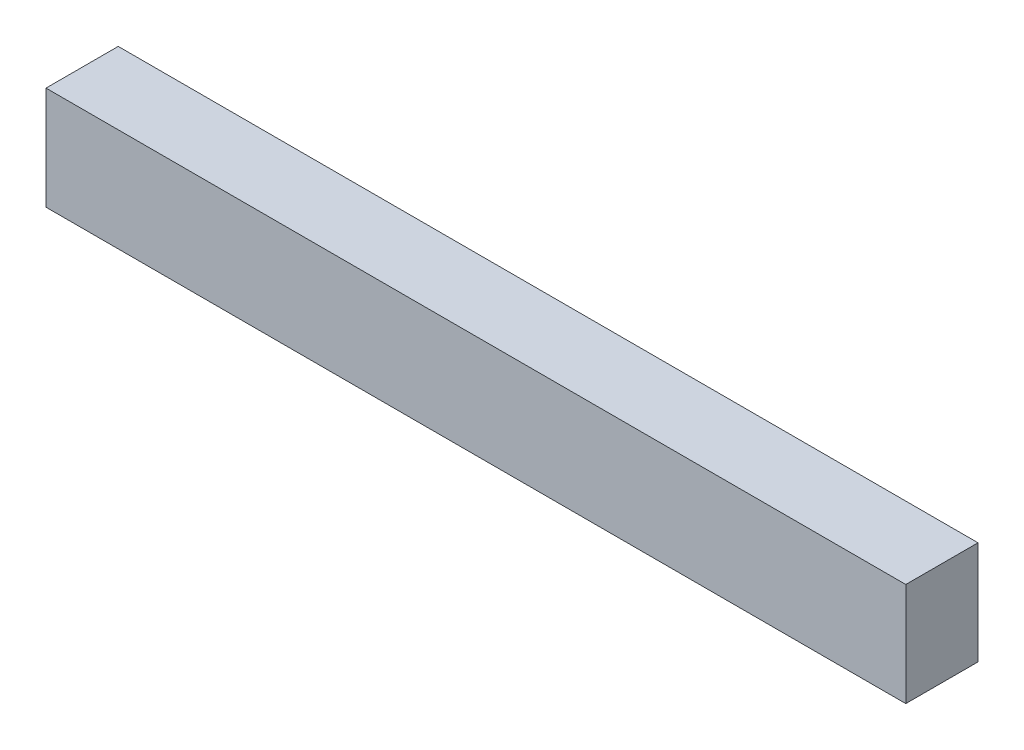
ISO-10303-21;
HEADER;
FILE_DESCRIPTION(('STEP AP214'),'2;1');
FILE_NAME('part.step','',(''),(''),'','','');
FILE_SCHEMA(('AUTOMOTIVE_DESIGN { 1 0 10303 214 1 1 1 1 }'));
ENDSEC;
DATA;
#1=APPLICATION_CONTEXT('core data for automotive mechanical design processes');
#2=APPLICATION_PROTOCOL_DEFINITION('international standard','automotive_design',2000,#1);
#3=PRODUCT_CONTEXT('',#1,'mechanical');
#4=PRODUCT('Part','Part','',(#3));
#5=PRODUCT_RELATED_PRODUCT_CATEGORY('part','',(#4));
#6=PRODUCT_DEFINITION_FORMATION('','',#4);
#7=PRODUCT_DEFINITION_CONTEXT('part definition',#1,'design');
#8=PRODUCT_DEFINITION('design','',#6,#7);
#9=PRODUCT_DEFINITION_SHAPE('','',#8);
#10=(LENGTH_UNIT() NAMED_UNIT(*) SI_UNIT(.MILLI.,.METRE.));
#11=(NAMED_UNIT(*) PLANE_ANGLE_UNIT() SI_UNIT($,.RADIAN.));
#12=(NAMED_UNIT(*) SI_UNIT($,.STERADIAN.) SOLID_ANGLE_UNIT());
#13=UNCERTAINTY_MEASURE_WITH_UNIT(LENGTH_MEASURE(1.E-05),#10,'distance_accuracy_value','');
#14=(GEOMETRIC_REPRESENTATION_CONTEXT(3) GLOBAL_UNCERTAINTY_ASSIGNED_CONTEXT((#13)) GLOBAL_UNIT_ASSIGNED_CONTEXT((#10,
#11,#12)) REPRESENTATION_CONTEXT('',''));
#15=CARTESIAN_POINT('',(0.,0.,0.));
#16=DIRECTION('',(0.,0.,1.));
#17=DIRECTION('',(1.,0.,0.));
#18=AXIS2_PLACEMENT_3D('',#15,#16,#17);
#19=CARTESIAN_POINT('',(-49.7007665376516,13.5095063199604,5.334));
#20=DIRECTION('',(1.,0.,0.));
#21=DIRECTION('',(0.,0.,-1.));
#22=AXIS2_PLACEMENT_3D('',#19,#20,#21);
#23=PLANE('',#22);
#24=DIRECTION('',(0.,-1.,0.));
#25=VECTOR('',#24,1.);
#26=CARTESIAN_POINT('',(-49.7007665376516,13.5095063199604,0.));
#27=LINE('',#26,#25);
#28=CARTESIAN_POINT('',(-49.7007665376516,13.5095063199604,0.));
#29=VERTEX_POINT('',#28);
#30=CARTESIAN_POINT('',(-49.7007665376516,5.8895063199604,0.));
#31=VERTEX_POINT('',#30);
#32=EDGE_CURVE('E98',#29,#31,#27,.T.);
#33=ORIENTED_EDGE('',*,*,#32,.T.);
#34=DIRECTION('',(0.,0.,-1.));
#35=VECTOR('',#34,1.);
#36=CARTESIAN_POINT('',(-49.7007665376516,5.8895063199604,5.334));
#37=LINE('',#36,#35);
#38=CARTESIAN_POINT('',(-49.7007665376516,5.8895063199604,5.334));
#39=VERTEX_POINT('',#38);
#40=EDGE_CURVE('E11',#39,#31,#37,.T.);
#41=ORIENTED_EDGE('',*,*,#40,.F.);
#42=DIRECTION('',(0.,-1.,0.));
#43=VECTOR('',#42,1.);
#44=CARTESIAN_POINT('',(-49.7007665376516,13.5095063199604,5.334));
#45=LINE('',#44,#43);
#46=CARTESIAN_POINT('',(-49.7007665376516,13.5095063199604,5.334));
#47=VERTEX_POINT('',#46);
#48=EDGE_CURVE('E86',#47,#39,#45,.T.);
#49=ORIENTED_EDGE('',*,*,#48,.F.);
#50=DIRECTION('',(0.,0.,-1.));
#51=VECTOR('',#50,1.);
#52=CARTESIAN_POINT('',(-49.7007665376516,13.5095063199604,5.334));
#53=LINE('',#52,#51);
#54=EDGE_CURVE('E94',#47,#29,#53,.T.);
#55=ORIENTED_EDGE('',*,*,#54,.T.);
#56=EDGE_LOOP('',(#33,#41,#49,#55));
#57=FACE_BOUND('',#56,.T.);
#58=ADVANCED_FACE('F35',(#57),#23,.F.);
#59=CARTESIAN_POINT('',(-49.7007665376516,5.8895063199604,5.334));
#60=DIRECTION('',(0.,1.,0.));
#61=DIRECTION('',(-1.,0.,0.));
#62=AXIS2_PLACEMENT_3D('',#59,#60,#61);
#63=PLANE('',#62);
#64=DIRECTION('',(1.,0.,0.));
#65=VECTOR('',#64,1.);
#66=CARTESIAN_POINT('',(-49.7007665376516,5.8895063199604,0.));
#67=LINE('',#66,#65);
#68=CARTESIAN_POINT('',(13.7992334623484,5.8895063199604,0.));
#69=VERTEX_POINT('',#68);
#70=EDGE_CURVE('E90',#31,#69,#67,.T.);
#71=ORIENTED_EDGE('',*,*,#70,.T.);
#72=DIRECTION('',(0.,0.,-1.));
#73=VECTOR('',#72,1.);
#74=CARTESIAN_POINT('',(13.7992334623484,5.8895063199604,5.334));
#75=LINE('',#74,#73);
#76=CARTESIAN_POINT('',(13.7992334623484,5.8895063199604,5.334));
#77=VERTEX_POINT('',#76);
#78=EDGE_CURVE('E43',#77,#69,#75,.T.);
#79=ORIENTED_EDGE('',*,*,#78,.F.);
#80=DIRECTION('',(1.,0.,0.));
#81=VECTOR('',#80,1.);
#82=CARTESIAN_POINT('',(-49.7007665376516,5.8895063199604,5.334));
#83=LINE('',#82,#81);
#84=EDGE_CURVE('E81',#39,#77,#83,.T.);
#85=ORIENTED_EDGE('',*,*,#84,.F.);
#86=ORIENTED_EDGE('',*,*,#40,.T.);
#87=EDGE_LOOP('',(#71,#79,#85,#86));
#88=FACE_BOUND('',#87,.T.);
#89=ADVANCED_FACE('F89',(#88),#63,.F.);
#90=CARTESIAN_POINT('',(13.7992334623484,13.5095063199604,5.334));
#91=DIRECTION('',(-1.,0.,0.));
#92=DIRECTION('',(0.,-1.,0.));
#93=AXIS2_PLACEMENT_3D('',#90,#91,#92);
#94=PLANE('',#93);
#95=DIRECTION('',(0.,1.,0.));
#96=VECTOR('',#95,1.);
#97=CARTESIAN_POINT('',(13.7992334623484,13.5095063199604,0.));
#98=LINE('',#97,#96);
#99=CARTESIAN_POINT('',(13.7992334623484,13.5095063199604,0.));
#100=VERTEX_POINT('',#99);
#101=EDGE_CURVE('E68',#69,#100,#98,.T.);
#102=ORIENTED_EDGE('',*,*,#101,.T.);
#103=DIRECTION('',(0.,0.,-1.));
#104=VECTOR('',#103,1.);
#105=CARTESIAN_POINT('',(13.7992334623484,13.5095063199604,5.334));
#106=LINE('',#105,#104);
#107=CARTESIAN_POINT('',(13.7992334623484,13.5095063199604,5.334));
#108=VERTEX_POINT('',#107);
#109=EDGE_CURVE('E91',#108,#100,#106,.T.);
#110=ORIENTED_EDGE('',*,*,#109,.F.);
#111=DIRECTION('',(0.,1.,0.));
#112=VECTOR('',#111,1.);
#113=CARTESIAN_POINT('',(13.7992334623484,13.5095063199604,5.334));
#114=LINE('',#113,#112);
#115=EDGE_CURVE('E84',#77,#108,#114,.T.);
#116=ORIENTED_EDGE('',*,*,#115,.F.);
#117=ORIENTED_EDGE('',*,*,#78,.T.);
#118=EDGE_LOOP('',(#102,#110,#116,#117));
#119=FACE_BOUND('',#118,.T.);
#120=ADVANCED_FACE('F92',(#119),#94,.F.);
#121=CARTESIAN_POINT('',(-49.7007665376516,13.5095063199604,5.334));
#122=DIRECTION('',(0.,-1.,0.));
#123=DIRECTION('',(0.,0.,-1.));
#124=AXIS2_PLACEMENT_3D('',#121,#122,#123);
#125=PLANE('',#124);
#126=DIRECTION('',(-1.,0.,0.));
#127=VECTOR('',#126,1.);
#128=CARTESIAN_POINT('',(-49.7007665376516,13.5095063199604,0.));
#129=LINE('',#128,#127);
#130=EDGE_CURVE('E74',#100,#29,#129,.T.);
#131=ORIENTED_EDGE('',*,*,#130,.T.);
#132=ORIENTED_EDGE('',*,*,#54,.F.);
#133=DIRECTION('',(-1.,0.,0.));
#134=VECTOR('',#133,1.);
#135=CARTESIAN_POINT('',(-49.7007665376516,13.5095063199604,5.334));
#136=LINE('',#135,#134);
#137=EDGE_CURVE('E51',#108,#47,#136,.T.);
#138=ORIENTED_EDGE('',*,*,#137,.F.);
#139=ORIENTED_EDGE('',*,*,#109,.T.);
#140=EDGE_LOOP('',(#131,#132,#138,#139));
#141=FACE_BOUND('',#140,.T.);
#142=ADVANCED_FACE('F105',(#141),#125,.F.);
#143=CARTESIAN_POINT('',(0.,0.,5.334));
#144=DIRECTION('',(0.,0.,1.));
#145=DIRECTION('',(1.,0.,0.));
#146=AXIS2_PLACEMENT_3D('',#143,#144,#145);
#147=PLANE('',#146);
#148=ORIENTED_EDGE('',*,*,#48,.T.);
#149=ORIENTED_EDGE('',*,*,#84,.T.);
#150=ORIENTED_EDGE('',*,*,#115,.T.);
#151=ORIENTED_EDGE('',*,*,#137,.T.);
#152=EDGE_LOOP('',(#148,#149,#150,#151));
#153=FACE_BOUND('',#152,.T.);
#154=ADVANCED_FACE('F82',(#153),#147,.T.);
#155=CARTESIAN_POINT('',(0.,0.,0.));
#156=DIRECTION('',(0.,0.,1.));
#157=DIRECTION('',(1.,0.,0.));
#158=AXIS2_PLACEMENT_3D('',#155,#156,#157);
#159=PLANE('',#158);
#160=ORIENTED_EDGE('',*,*,#32,.F.);
#161=ORIENTED_EDGE('',*,*,#130,.F.);
#162=ORIENTED_EDGE('',*,*,#101,.F.);
#163=ORIENTED_EDGE('',*,*,#70,.F.);
#164=EDGE_LOOP('',(#160,#161,#162,#163));
#165=FACE_BOUND('',#164,.T.);
#166=ADVANCED_FACE('F108',(#165),#159,.F.);
#167=CLOSED_SHELL('',(#58,#89,#120,#142,#154,#166));
#168=MANIFOLD_SOLID_BREP('B2',#167);
#169=ADVANCED_BREP_SHAPE_REPRESENTATION('',(#18,#168),#14);
#170=SHAPE_DEFINITION_REPRESENTATION(#9,#169);
ENDSEC;
END-ISO-10303-21;
